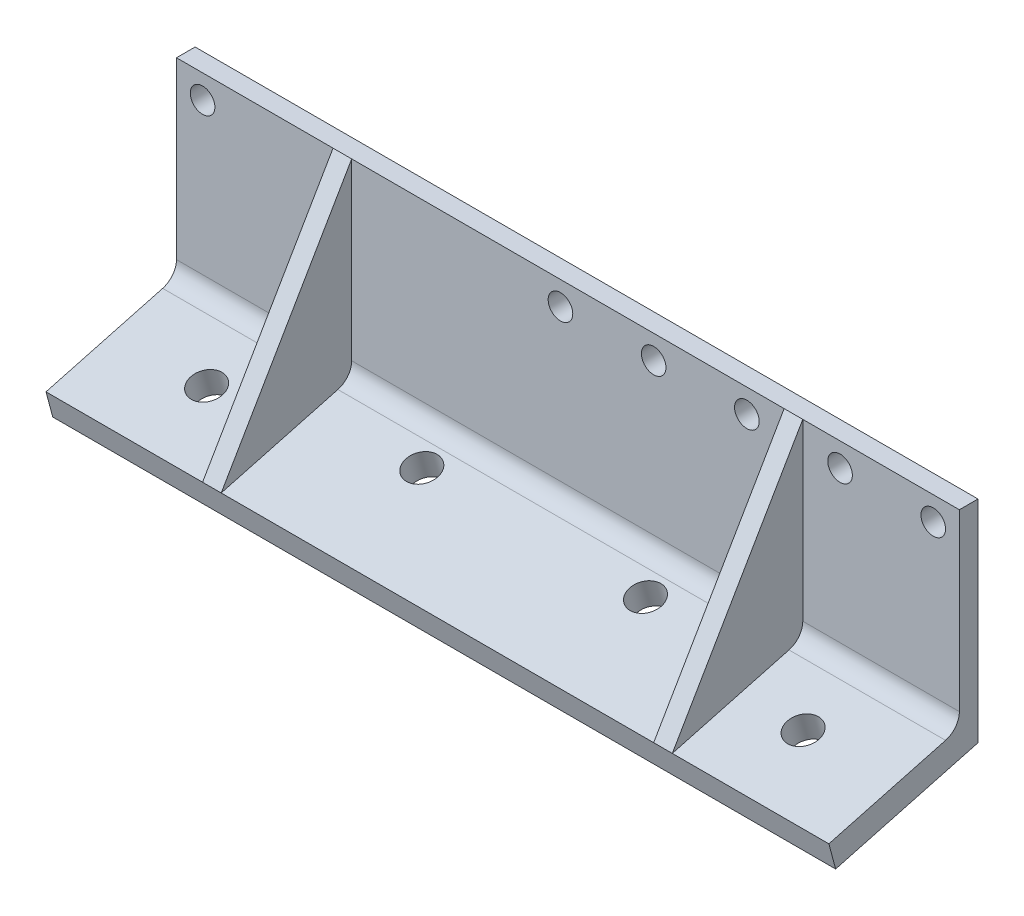
ISO-10303-21;
HEADER;
FILE_DESCRIPTION(('STEP AP214'),'2;1');
FILE_NAME('part.step','',(''),(''),'','','');
FILE_SCHEMA(('AUTOMOTIVE_DESIGN { 1 0 10303 214 1 1 1 1 }'));
ENDSEC;
DATA;
#1=APPLICATION_CONTEXT('core data for automotive mechanical design processes');
#2=APPLICATION_PROTOCOL_DEFINITION('international standard','automotive_design',2000,#1);
#3=PRODUCT_CONTEXT('',#1,'mechanical');
#4=PRODUCT('Part','Part','',(#3));
#5=PRODUCT_RELATED_PRODUCT_CATEGORY('part','',(#4));
#6=PRODUCT_DEFINITION_FORMATION('','',#4);
#7=PRODUCT_DEFINITION_CONTEXT('part definition',#1,'design');
#8=PRODUCT_DEFINITION('design','',#6,#7);
#9=PRODUCT_DEFINITION_SHAPE('','',#8);
#10=(LENGTH_UNIT() NAMED_UNIT(*) SI_UNIT(.MILLI.,.METRE.));
#11=(NAMED_UNIT(*) PLANE_ANGLE_UNIT() SI_UNIT($,.RADIAN.));
#12=(NAMED_UNIT(*) SI_UNIT($,.STERADIAN.) SOLID_ANGLE_UNIT());
#13=UNCERTAINTY_MEASURE_WITH_UNIT(LENGTH_MEASURE(1.E-05),#10,'distance_accuracy_value','');
#14=(GEOMETRIC_REPRESENTATION_CONTEXT(3) GLOBAL_UNCERTAINTY_ASSIGNED_CONTEXT((#13)) GLOBAL_UNIT_ASSIGNED_CONTEXT((#10,
#11,#12)) REPRESENTATION_CONTEXT('',''));
#15=CARTESIAN_POINT('',(0.,0.,0.));
#16=DIRECTION('',(0.,0.,1.));
#17=DIRECTION('',(1.,0.,0.));
#18=AXIS2_PLACEMENT_3D('',#15,#16,#17);
#19=CARTESIAN_POINT('',(-52.,-241.069901587953,57.));
#20=DIRECTION('',(0.,0.,1.));
#21=DIRECTION('',(1.,0.,0.));
#22=AXIS2_PLACEMENT_3D('',#19,#20,#21);
#23=PLANE('',#22);
#24=CARTESIAN_POINT('',(101.,23.65,57.));
#25=DIRECTION('',(0.,0.,1.));
#26=DIRECTION('',(1.,0.,0.));
#27=AXIS2_PLACEMENT_3D('',#24,#25,#26);
#28=CIRCLE('',#27,3.30000000000001);
#29=CARTESIAN_POINT('',(104.3,23.65,57.));
#30=VERTEX_POINT('',#29);
#31=EDGE_CURVE('E437',#30,#30,#28,.T.);
#32=ORIENTED_EDGE('',*,*,#31,.F.);
#33=EDGE_LOOP('',(#32));
#34=FACE_BOUND('',#33,.T.);
#35=CARTESIAN_POINT('',(76.,23.65,57.));
#36=DIRECTION('',(0.,0.,1.));
#37=DIRECTION('',(1.,0.,0.));
#38=AXIS2_PLACEMENT_3D('',#35,#36,#37);
#39=CIRCLE('',#38,3.30000000000001);
#40=CARTESIAN_POINT('',(79.3,23.65,57.));
#41=VERTEX_POINT('',#40);
#42=EDGE_CURVE('E446',#41,#41,#39,.T.);
#43=ORIENTED_EDGE('',*,*,#42,.F.);
#44=EDGE_LOOP('',(#43));
#45=FACE_BOUND('',#44,.T.);
#46=CARTESIAN_POINT('',(51.,23.65,57.));
#47=DIRECTION('',(0.,0.,1.));
#48=DIRECTION('',(1.,0.,0.));
#49=AXIS2_PLACEMENT_3D('',#46,#47,#48);
#50=CIRCLE('',#49,3.3);
#51=CARTESIAN_POINT('',(54.3,23.65,57.));
#52=VERTEX_POINT('',#51);
#53=EDGE_CURVE('E452',#52,#52,#50,.T.);
#54=ORIENTED_EDGE('',*,*,#53,.F.);
#55=EDGE_LOOP('',(#54));
#56=FACE_BOUND('',#55,.T.);
#57=DIRECTION('',(1.,0.,0.));
#58=VECTOR('',#57,1.);
#59=CARTESIAN_POINT('',(-52.,30.,57.));
#60=LINE('',#59,#58);
#61=CARTESIAN_POINT('',(-4.99999999999999,30.,57.));
#62=VERTEX_POINT('',#61);
#63=CARTESIAN_POINT('',(111.,30.,57.));
#64=VERTEX_POINT('',#63);
#65=EDGE_CURVE('E194',#62,#64,#60,.T.);
#66=ORIENTED_EDGE('',*,*,#65,.F.);
#67=DIRECTION('',(0.,-1.,0.));
#68=VECTOR('',#67,1.);
#69=CARTESIAN_POINT('',(-4.99999999999999,30.,57.));
#70=LINE('',#69,#68);
#71=CARTESIAN_POINT('',(-4.99999999999999,-16.891642309636,57.));
#72=VERTEX_POINT('',#71);
#73=EDGE_CURVE('E280',#62,#72,#70,.T.);
#74=ORIENTED_EDGE('',*,*,#73,.T.);
#75=DIRECTION('',(-1.,0.,0.));
#76=VECTOR('',#75,1.);
#77=CARTESIAN_POINT('',(153.,-16.891642309636,57.));
#78=LINE('',#77,#76);
#79=CARTESIAN_POINT('',(111.,-16.891642309636,57.));
#80=VERTEX_POINT('',#79);
#81=EDGE_CURVE('E51',#72,#80,#78,.F.);
#82=ORIENTED_EDGE('',*,*,#81,.T.);
#83=DIRECTION('',(0.,1.,0.));
#84=VECTOR('',#83,1.);
#85=CARTESIAN_POINT('',(111.,-16.891642309636,57.));
#86=LINE('',#85,#84);
#87=EDGE_CURVE('E298',#80,#64,#86,.T.);
#88=ORIENTED_EDGE('',*,*,#87,.T.);
#89=EDGE_LOOP('',(#66,#74,#82,#88));
#90=FACE_BOUND('',#89,.T.);
#91=ADVANCED_FACE('F42',(#34,#45,#56,#90),#23,.T.);
#92=CARTESIAN_POINT('',(196.54205491934,-30.10649898462,92.));
#93=DIRECTION('',(0.,0.965925826289069,0.258819045102519));
#94=DIRECTION('',(0.,-0.258819045102519,0.965925826289069));
#95=AXIS2_PLACEMENT_3D('',#92,#93,#94);
#96=PLANE('',#95);
#97=CARTESIAN_POINT('',(23.,-23.1905949207632,66.1894946534139));
#98=DIRECTION('',(0.,0.965925826289069,0.258819045102519));
#99=DIRECTION('',(0.,-0.258819045102519,0.965925826289069));
#100=AXIS2_PLACEMENT_3D('',#97,#98,#99);
#101=CIRCLE('',#100,4.25);
#102=CARTESIAN_POINT('',(23.,-24.2905758624489,70.2946794151424));
#103=VERTEX_POINT('',#102);
#104=EDGE_CURVE('E328',#103,#103,#101,.T.);
#105=ORIENTED_EDGE('',*,*,#104,.F.);
#106=EDGE_LOOP('',(#105));
#107=FACE_BOUND('',#106,.T.);
#108=CARTESIAN_POINT('',(83.,-23.1905949207632,66.1894946534139));
#109=DIRECTION('',(0.,0.965925826289069,0.258819045102519));
#110=DIRECTION('',(0.,-0.258819045102519,0.965925826289069));
#111=AXIS2_PLACEMENT_3D('',#108,#109,#110);
#112=CIRCLE('',#111,4.25);
#113=CARTESIAN_POINT('',(83.,-24.2905758624489,70.2946794151424));
#114=VERTEX_POINT('',#113);
#115=EDGE_CURVE('E332',#114,#114,#112,.T.);
#116=ORIENTED_EDGE('',*,*,#115,.F.);
#117=EDGE_LOOP('',(#116));
#118=FACE_BOUND('',#117,.T.);
#119=DIRECTION('',(-1.,0.,0.));
#120=VECTOR('',#119,1.);
#121=CARTESIAN_POINT('',(-47.,-21.7212714410813,60.7059047744874));
#122=LINE('',#121,#120);
#123=CARTESIAN_POINT('',(111.,-21.7212714410813,60.7059047744874));
#124=VERTEX_POINT('',#123);
#125=CARTESIAN_POINT('',(-4.99999999999999,-21.7212714410813,60.7059047744874));
#126=VERTEX_POINT('',#125);
#127=EDGE_CURVE('E229',#124,#126,#122,.T.);
#128=ORIENTED_EDGE('',*,*,#127,.T.);
#129=DIRECTION('',(0.,-0.258819045102519,0.965925826289069));
#130=VECTOR('',#129,1.);
#131=CARTESIAN_POINT('',(-4.99999999999999,-21.7212714410813,60.7059047744874));
#132=LINE('',#131,#130);
#133=CARTESIAN_POINT('',(-4.99999999999999,-30.10649898462,92.));
#134=VERTEX_POINT('',#133);
#135=EDGE_CURVE('E272',#126,#134,#132,.T.);
#136=ORIENTED_EDGE('',*,*,#135,.T.);
#137=DIRECTION('',(-1.,0.,0.));
#138=VECTOR('',#137,1.);
#139=CARTESIAN_POINT('',(196.54205491934,-30.10649898462,92.));
#140=LINE('',#139,#138);
#141=CARTESIAN_POINT('',(111.,-30.10649898462,92.));
#142=VERTEX_POINT('',#141);
#143=EDGE_CURVE('E202',#142,#134,#140,.T.);
#144=ORIENTED_EDGE('',*,*,#143,.F.);
#145=DIRECTION('',(0.,0.258819045102519,-0.965925826289069));
#146=VECTOR('',#145,1.);
#147=CARTESIAN_POINT('',(111.,-30.10649898462,92.));
#148=LINE('',#147,#146);
#149=EDGE_CURVE('E307',#142,#124,#148,.T.);
#150=ORIENTED_EDGE('',*,*,#149,.T.);
#151=EDGE_LOOP('',(#128,#136,#144,#150));
#152=FACE_BOUND('',#151,.T.);
#153=ADVANCED_FACE('F379',(#107,#118,#152),#96,.T.);
#154=CARTESIAN_POINT('',(196.54205491934,-16.891642309636,62.));
#155=DIRECTION('',(1.,0.,0.));
#156=DIRECTION('',(0.,0.,-1.));
#157=AXIS2_PLACEMENT_3D('',#154,#155,#156);
#158=CYLINDRICAL_SURFACE('',#157,5.);
#159=CARTESIAN_POINT('',(-4.99999999999999,-16.891642309636,62.));
#160=DIRECTION('',(-1.,0.,0.));
#161=DIRECTION('',(0.,0.,1.));
#162=AXIS2_PLACEMENT_3D('',#159,#160,#161);
#163=CIRCLE('',#162,5.);
#164=EDGE_CURVE('E283',#72,#126,#163,.T.);
#165=ORIENTED_EDGE('',*,*,#164,.T.);
#166=ORIENTED_EDGE('',*,*,#127,.F.);
#167=CARTESIAN_POINT('',(111.,-16.891642309636,62.));
#168=DIRECTION('',(1.,0.,0.));
#169=DIRECTION('',(0.,0.,-1.));
#170=AXIS2_PLACEMENT_3D('',#167,#168,#169);
#171=CIRCLE('',#170,5.);
#172=EDGE_CURVE('E310',#124,#80,#171,.T.);
#173=ORIENTED_EDGE('',*,*,#172,.T.);
#174=ORIENTED_EDGE('',*,*,#81,.F.);
#175=EDGE_LOOP('',(#165,#166,#173,#174));
#176=FACE_BOUND('',#175,.T.);
#177=ADVANCED_FACE('F383',(#176),#158,.F.);
#178=CARTESIAN_POINT('',(-45.,23.65,57.));
#179=DIRECTION('',(0.,0.,1.));
#180=DIRECTION('',(1.,0.,0.));
#181=AXIS2_PLACEMENT_3D('',#178,#179,#180);
#182=CIRCLE('',#181,3.3);
#183=CARTESIAN_POINT('',(-41.7,23.65,57.));
#184=VERTEX_POINT('',#183);
#185=EDGE_CURVE('E540',#184,#184,#182,.T.);
#186=ORIENTED_EDGE('',*,*,#185,.F.);
#187=EDGE_LOOP('',(#186));
#188=FACE_BOUND('',#187,.T.);
#189=DIRECTION('',(0.,-1.,0.));
#190=VECTOR('',#189,1.);
#191=CARTESIAN_POINT('',(-9.99999999999998,30.,57.));
#192=LINE('',#191,#190);
#193=CARTESIAN_POINT('',(-9.99999999999998,30.,57.));
#194=VERTEX_POINT('',#193);
#195=CARTESIAN_POINT('',(-9.99999999999998,-16.891642309636,57.));
#196=VERTEX_POINT('',#195);
#197=EDGE_CURVE('E271',#194,#196,#192,.T.);
#198=ORIENTED_EDGE('',*,*,#197,.F.);
#199=CARTESIAN_POINT('',(-52.,30.,57.));
#200=VERTEX_POINT('',#199);
#201=EDGE_CURVE('E206',#200,#194,#60,.T.);
#202=ORIENTED_EDGE('',*,*,#201,.F.);
#203=DIRECTION('',(0.,1.,0.));
#204=VECTOR('',#203,1.);
#205=CARTESIAN_POINT('',(-52.,-16.891642309636,57.));
#206=LINE('',#205,#204);
#207=CARTESIAN_POINT('',(-52.,-16.891642309636,57.));
#208=VERTEX_POINT('',#207);
#209=EDGE_CURVE('E256',#208,#200,#206,.T.);
#210=ORIENTED_EDGE('',*,*,#209,.F.);
#211=EDGE_CURVE('E11',#208,#196,#78,.F.);
#212=ORIENTED_EDGE('',*,*,#211,.T.);
#213=EDGE_LOOP('',(#198,#202,#210,#212));
#214=FACE_BOUND('',#213,.T.);
#215=ADVANCED_FACE('F390',(#188,#214),#23,.T.);
#216=DIRECTION('',(0.,-0.258819045102519,0.965925826289069));
#217=VECTOR('',#216,1.);
#218=CARTESIAN_POINT('',(-9.99999999999998,-21.7212714410813,60.7059047744874));
#219=LINE('',#218,#217);
#220=CARTESIAN_POINT('',(-9.99999999999998,-21.7212714410813,60.7059047744874));
#221=VERTEX_POINT('',#220);
#222=CARTESIAN_POINT('',(-9.99999999999993,-30.10649898462,92.));
#223=VERTEX_POINT('',#222);
#224=EDGE_CURVE('E247',#221,#223,#219,.T.);
#225=ORIENTED_EDGE('',*,*,#224,.F.);
#226=CARTESIAN_POINT('',(-52.,-21.7212714410813,60.7059047744874));
#227=VERTEX_POINT('',#226);
#228=EDGE_CURVE('E170',#221,#227,#122,.T.);
#229=ORIENTED_EDGE('',*,*,#228,.T.);
#230=DIRECTION('',(0.,0.258819045102519,-0.965925826289069));
#231=VECTOR('',#230,1.);
#232=CARTESIAN_POINT('',(-52.,-30.10649898462,92.));
#233=LINE('',#232,#231);
#234=CARTESIAN_POINT('',(-52.,-30.10649898462,92.));
#235=VERTEX_POINT('',#234);
#236=EDGE_CURVE('E245',#235,#227,#233,.T.);
#237=ORIENTED_EDGE('',*,*,#236,.F.);
#238=DIRECTION('',(-1.,0.,0.));
#239=VECTOR('',#238,1.);
#240=CARTESIAN_POINT('',(-47.,-30.10649898462,92.));
#241=LINE('',#240,#239);
#242=EDGE_CURVE('E59',#223,#235,#241,.T.);
#243=ORIENTED_EDGE('',*,*,#242,.F.);
#244=EDGE_LOOP('',(#225,#229,#237,#243));
#245=FACE_BOUND('',#244,.T.);
#246=CARTESIAN_POINT('',(-27.,-25.2611472815833,73.9169012637264));
#247=DIRECTION('',(0.,0.965925826289069,0.258819045102519));
#248=DIRECTION('',(0.,-0.258819045102519,0.965925826289069));
#249=AXIS2_PLACEMENT_3D('',#246,#247,#248);
#250=CIRCLE('',#249,4.25);
#251=CARTESIAN_POINT('',(-27.,-26.361128223269,78.022086025455));
#252=VERTEX_POINT('',#251);
#253=EDGE_CURVE('E324',#252,#252,#250,.T.);
#254=ORIENTED_EDGE('',*,*,#253,.F.);
#255=EDGE_LOOP('',(#254));
#256=FACE_BOUND('',#255,.T.);
#257=ADVANCED_FACE('F242',(#245,#256),#96,.T.);
#258=ORIENTED_EDGE('',*,*,#228,.F.);
#259=CARTESIAN_POINT('',(-9.99999999999998,-16.891642309636,62.));
#260=DIRECTION('',(-1.,0.,0.));
#261=DIRECTION('',(0.,0.,1.));
#262=AXIS2_PLACEMENT_3D('',#259,#260,#261);
#263=CIRCLE('',#262,5.);
#264=EDGE_CURVE('E274',#196,#221,#263,.T.);
#265=ORIENTED_EDGE('',*,*,#264,.F.);
#266=ORIENTED_EDGE('',*,*,#211,.F.);
#267=CARTESIAN_POINT('',(-52.,-16.891642309636,62.));
#268=DIRECTION('',(1.,0.,0.));
#269=DIRECTION('',(0.,0.,-1.));
#270=AXIS2_PLACEMENT_3D('',#267,#268,#269);
#271=CIRCLE('',#270,5.);
#272=EDGE_CURVE('E251',#227,#208,#271,.T.);
#273=ORIENTED_EDGE('',*,*,#272,.F.);
#274=EDGE_LOOP('',(#258,#265,#266,#273));
#275=FACE_BOUND('',#274,.T.);
#276=ADVANCED_FACE('F252',(#275),#158,.F.);
#277=CARTESIAN_POINT('',(160.,30.,-31.93));
#278=DIRECTION('',(0.,1.,0.));
#279=DIRECTION('',(0.,0.,1.));
#280=AXIS2_PLACEMENT_3D('',#277,#278,#279);
#281=PLANE('',#280);
#282=DIRECTION('',(1.,0.,0.));
#283=VECTOR('',#282,1.);
#284=CARTESIAN_POINT('',(160.,30.,52.));
#285=LINE('',#284,#283);
#286=CARTESIAN_POINT('',(-52.,30.,52.));
#287=VERTEX_POINT('',#286);
#288=CARTESIAN_POINT('',(158.,30.,52.));
#289=VERTEX_POINT('',#288);
#290=EDGE_CURVE('E321',#287,#289,#285,.T.);
#291=ORIENTED_EDGE('',*,*,#290,.F.);
#292=DIRECTION('',(0.,0.,1.));
#293=VECTOR('',#292,1.);
#294=CARTESIAN_POINT('',(-52.,30.,0.));
#295=LINE('',#294,#293);
#296=EDGE_CURVE('E171',#287,#200,#295,.T.);
#297=ORIENTED_EDGE('',*,*,#296,.T.);
#298=ORIENTED_EDGE('',*,*,#201,.T.);
#299=DIRECTION('',(1.,0.,0.));
#300=VECTOR('',#299,1.);
#301=CARTESIAN_POINT('',(-9.99999999999998,30.,57.));
#302=LINE('',#301,#300);
#303=EDGE_CURVE('E289',#194,#62,#302,.T.);
#304=ORIENTED_EDGE('',*,*,#303,.T.);
#305=ORIENTED_EDGE('',*,*,#65,.T.);
#306=DIRECTION('',(-1.,0.,0.));
#307=VECTOR('',#306,1.);
#308=CARTESIAN_POINT('',(116.,30.,57.));
#309=LINE('',#308,#307);
#310=CARTESIAN_POINT('',(116.,30.,57.));
#311=VERTEX_POINT('',#310);
#312=EDGE_CURVE('E175',#311,#64,#309,.T.);
#313=ORIENTED_EDGE('',*,*,#312,.F.);
#314=DIRECTION('',(1.,0.,0.));
#315=VECTOR('',#314,1.);
#316=CARTESIAN_POINT('',(153.,30.,57.));
#317=LINE('',#316,#315);
#318=CARTESIAN_POINT('',(158.,30.,57.));
#319=VERTEX_POINT('',#318);
#320=EDGE_CURVE('E67',#311,#319,#317,.T.);
#321=ORIENTED_EDGE('',*,*,#320,.T.);
#322=DIRECTION('',(0.,0.,1.));
#323=VECTOR('',#322,1.);
#324=CARTESIAN_POINT('',(158.,30.,0.));
#325=LINE('',#324,#323);
#326=EDGE_CURVE('E161',#289,#319,#325,.T.);
#327=ORIENTED_EDGE('',*,*,#326,.F.);
#328=EDGE_LOOP('',(#291,#297,#298,#304,#305,#313,#321,#327));
#329=FACE_BOUND('',#328,.T.);
#330=ADVANCED_FACE('F173',(#329),#281,.T.);
#331=CARTESIAN_POINT('',(158.,0.,0.));
#332=DIRECTION('',(-1.,0.,0.));
#333=DIRECTION('',(0.,0.,1.));
#334=AXIS2_PLACEMENT_3D('',#331,#332,#333);
#335=PLANE('',#334);
#336=CARTESIAN_POINT('',(158.,-16.891642309636,62.));
#337=DIRECTION('',(-1.,0.,0.));
#338=DIRECTION('',(0.,0.,1.));
#339=AXIS2_PLACEMENT_3D('',#336,#337,#338);
#340=CIRCLE('',#339,5.);
#341=CARTESIAN_POINT('',(158.,-16.891642309636,57.));
#342=VERTEX_POINT('',#341);
#343=CARTESIAN_POINT('',(158.,-21.7212714410813,60.7059047744874));
#344=VERTEX_POINT('',#343);
#345=EDGE_CURVE('E157',#342,#344,#340,.T.);
#346=ORIENTED_EDGE('',*,*,#345,.T.);
#347=DIRECTION('',(0.,-0.258819045102519,0.965925826289069));
#348=VECTOR('',#347,1.);
#349=CARTESIAN_POINT('',(158.,-21.7212714410813,60.7059047744874));
#350=LINE('',#349,#348);
#351=CARTESIAN_POINT('',(158.,-30.10649898462,92.));
#352=VERTEX_POINT('',#351);
#353=EDGE_CURVE('E260',#344,#352,#350,.T.);
#354=ORIENTED_EDGE('',*,*,#353,.T.);
#355=DIRECTION('',(0.,-0.965925826289069,-0.258819045102518));
#356=VECTOR('',#355,1.);
#357=CARTESIAN_POINT('',(158.,-36.8679797686435,90.1882666842824));
#358=LINE('',#357,#356);
#359=CARTESIAN_POINT('',(158.,-36.8679797686435,90.1882666842824));
#360=VERTEX_POINT('',#359);
#361=EDGE_CURVE('E190',#352,#360,#358,.T.);
#362=ORIENTED_EDGE('',*,*,#361,.T.);
#363=DIRECTION('',(0.,0.258819045102521,-0.965925826289068));
#364=VECTOR('',#363,1.);
#365=CARTESIAN_POINT('',(158.,-40.9998481086648,105.608609259427));
#366=LINE('',#365,#364);
#367=CARTESIAN_POINT('',(158.,-26.6354645502457,52.));
#368=VERTEX_POINT('',#367);
#369=EDGE_CURVE('E209',#360,#368,#366,.T.);
#370=ORIENTED_EDGE('',*,*,#369,.T.);
#371=DIRECTION('',(0.,1.,0.));
#372=VECTOR('',#371,1.);
#373=CARTESIAN_POINT('',(158.,-241.069901587953,52.));
#374=LINE('',#373,#372);
#375=EDGE_CURVE('E165',#368,#289,#374,.T.);
#376=ORIENTED_EDGE('',*,*,#375,.T.);
#377=ORIENTED_EDGE('',*,*,#326,.T.);
#378=DIRECTION('',(0.,-1.,0.));
#379=VECTOR('',#378,1.);
#380=CARTESIAN_POINT('',(158.,30.,57.));
#381=LINE('',#380,#379);
#382=EDGE_CURVE('E150',#319,#342,#381,.T.);
#383=ORIENTED_EDGE('',*,*,#382,.T.);
#384=EDGE_LOOP('',(#346,#354,#362,#370,#376,#377,#383));
#385=FACE_BOUND('',#384,.T.);
#386=ADVANCED_FACE('F162',(#385),#335,.F.);
#387=CARTESIAN_POINT('',(-52.,0.,0.));
#388=DIRECTION('',(-1.,0.,0.));
#389=DIRECTION('',(0.,0.,1.));
#390=AXIS2_PLACEMENT_3D('',#387,#388,#389);
#391=PLANE('',#390);
#392=ORIENTED_EDGE('',*,*,#209,.T.);
#393=ORIENTED_EDGE('',*,*,#296,.F.);
#394=DIRECTION('',(0.,1.,0.));
#395=VECTOR('',#394,1.);
#396=CARTESIAN_POINT('',(-52.,-241.069901587953,52.));
#397=LINE('',#396,#395);
#398=CARTESIAN_POINT('',(-52.,-26.6354645502457,52.));
#399=VERTEX_POINT('',#398);
#400=EDGE_CURVE('E213',#399,#287,#397,.T.);
#401=ORIENTED_EDGE('',*,*,#400,.F.);
#402=DIRECTION('',(0.,-0.258819045102521,0.965925826289068));
#403=VECTOR('',#402,1.);
#404=CARTESIAN_POINT('',(-51.9999999999999,-40.9998481086648,105.608609259427));
#405=LINE('',#404,#403);
#406=CARTESIAN_POINT('',(-52.,-36.8679797686435,90.1882666842824));
#407=VERTEX_POINT('',#406);
#408=EDGE_CURVE('E210',#399,#407,#405,.T.);
#409=ORIENTED_EDGE('',*,*,#408,.T.);
#410=DIRECTION('',(0.,0.965925826289069,0.258819045102519));
#411=VECTOR('',#410,1.);
#412=CARTESIAN_POINT('',(-52.,-36.8679797686435,90.1882666842824));
#413=LINE('',#412,#411);
#414=EDGE_CURVE('E183',#407,#235,#413,.T.);
#415=ORIENTED_EDGE('',*,*,#414,.T.);
#416=ORIENTED_EDGE('',*,*,#236,.T.);
#417=ORIENTED_EDGE('',*,*,#272,.T.);
#418=EDGE_LOOP('',(#392,#393,#401,#409,#415,#416,#417));
#419=FACE_BOUND('',#418,.T.);
#420=ADVANCED_FACE('F258',(#419),#391,.T.);
#421=CARTESIAN_POINT('',(-52.,-241.069901587953,52.));
#422=DIRECTION('',(0.,0.,-1.));
#423=DIRECTION('',(-1.,0.,0.));
#424=AXIS2_PLACEMENT_3D('',#421,#422,#423);
#425=PLANE('',#424);
#426=CARTESIAN_POINT('',(-45.,23.65,52.));
#427=DIRECTION('',(0.,0.,1.));
#428=DIRECTION('',(1.,0.,0.));
#429=AXIS2_PLACEMENT_3D('',#426,#427,#428);
#430=CIRCLE('',#429,3.3);
#431=CARTESIAN_POINT('',(-41.7,23.65,52.));
#432=VERTEX_POINT('',#431);
#433=EDGE_CURVE('E158',#432,#432,#430,.T.);
#434=ORIENTED_EDGE('',*,*,#433,.T.);
#435=EDGE_LOOP('',(#434));
#436=FACE_BOUND('',#435,.T.);
#437=CARTESIAN_POINT('',(151.,23.65,52.));
#438=DIRECTION('',(0.,0.,1.));
#439=DIRECTION('',(1.,0.,0.));
#440=AXIS2_PLACEMENT_3D('',#437,#438,#439);
#441=CIRCLE('',#440,3.3);
#442=CARTESIAN_POINT('',(154.3,23.65,52.));
#443=VERTEX_POINT('',#442);
#444=EDGE_CURVE('E500',#443,#443,#441,.T.);
#445=ORIENTED_EDGE('',*,*,#444,.T.);
#446=EDGE_LOOP('',(#445));
#447=FACE_BOUND('',#446,.T.);
#448=CARTESIAN_POINT('',(126.,23.65,52.));
#449=DIRECTION('',(0.,0.,1.));
#450=DIRECTION('',(1.,0.,0.));
#451=AXIS2_PLACEMENT_3D('',#448,#449,#450);
#452=CIRCLE('',#451,3.3);
#453=CARTESIAN_POINT('',(129.3,23.65,52.));
#454=VERTEX_POINT('',#453);
#455=EDGE_CURVE('E431',#454,#454,#452,.T.);
#456=ORIENTED_EDGE('',*,*,#455,.T.);
#457=EDGE_LOOP('',(#456));
#458=FACE_BOUND('',#457,.T.);
#459=CARTESIAN_POINT('',(101.,23.65,52.));
#460=DIRECTION('',(0.,0.,1.));
#461=DIRECTION('',(1.,0.,0.));
#462=AXIS2_PLACEMENT_3D('',#459,#460,#461);
#463=CIRCLE('',#462,3.30000000000001);
#464=CARTESIAN_POINT('',(104.3,23.65,52.));
#465=VERTEX_POINT('',#464);
#466=EDGE_CURVE('E432',#465,#465,#463,.T.);
#467=ORIENTED_EDGE('',*,*,#466,.T.);
#468=EDGE_LOOP('',(#467));
#469=FACE_BOUND('',#468,.T.);
#470=CARTESIAN_POINT('',(76.,23.65,52.));
#471=DIRECTION('',(0.,0.,1.));
#472=DIRECTION('',(1.,0.,0.));
#473=AXIS2_PLACEMENT_3D('',#470,#471,#472);
#474=CIRCLE('',#473,3.30000000000001);
#475=CARTESIAN_POINT('',(79.3,23.65,52.));
#476=VERTEX_POINT('',#475);
#477=EDGE_CURVE('E443',#476,#476,#474,.T.);
#478=ORIENTED_EDGE('',*,*,#477,.T.);
#479=EDGE_LOOP('',(#478));
#480=FACE_BOUND('',#479,.T.);
#481=CARTESIAN_POINT('',(51.,23.65,52.));
#482=DIRECTION('',(0.,0.,1.));
#483=DIRECTION('',(1.,0.,0.));
#484=AXIS2_PLACEMENT_3D('',#481,#482,#483);
#485=CIRCLE('',#484,3.3);
#486=CARTESIAN_POINT('',(54.3,23.65,52.));
#487=VERTEX_POINT('',#486);
#488=EDGE_CURVE('E449',#487,#487,#485,.T.);
#489=ORIENTED_EDGE('',*,*,#488,.T.);
#490=EDGE_LOOP('',(#489));
#491=FACE_BOUND('',#490,.T.);
#492=ORIENTED_EDGE('',*,*,#400,.T.);
#493=ORIENTED_EDGE('',*,*,#290,.T.);
#494=ORIENTED_EDGE('',*,*,#375,.F.);
#495=DIRECTION('',(-1.,0.,0.));
#496=VECTOR('',#495,1.);
#497=CARTESIAN_POINT('',(-52.,-26.6354645502457,52.));
#498=LINE('',#497,#496);
#499=EDGE_CURVE('E214',#368,#399,#498,.T.);
#500=ORIENTED_EDGE('',*,*,#499,.T.);
#501=EDGE_LOOP('',(#492,#493,#494,#500));
#502=FACE_BOUND('',#501,.T.);
#503=ADVANCED_FACE('F355',(#436,#447,#458,#469,#480,#491,#502),#425,.T.);
#504=CARTESIAN_POINT('',(0.,-11.8512267461792,-3.17552663595684));
#505=DIRECTION('',(0.,-0.965925826289068,-0.258819045102521));
#506=DIRECTION('',(0.,0.258819045102521,-0.965925826289068));
#507=AXIS2_PLACEMENT_3D('',#504,#505,#506);
#508=PLANE('',#507);
#509=CARTESIAN_POINT('',(-27.,-32.0226280656068,72.1051679480088));
#510=DIRECTION('',(0.,-0.965925826289068,-0.258819045102521));
#511=DIRECTION('',(0.,0.258819045102521,-0.965925826289068));
#512=AXIS2_PLACEMENT_3D('',#509,#510,#511);
#513=CIRCLE('',#512,4.25);
#514=CARTESIAN_POINT('',(-27.,-30.9226471239211,67.9999831862803));
#515=VERTEX_POINT('',#514);
#516=EDGE_CURVE('E178',#515,#515,#513,.T.);
#517=ORIENTED_EDGE('',*,*,#516,.F.);
#518=EDGE_LOOP('',(#517));
#519=FACE_BOUND('',#518,.T.);
#520=CARTESIAN_POINT('',(23.,-29.9520757047866,64.3777613376962));
#521=DIRECTION('',(0.,-0.965925826289068,-0.258819045102521));
#522=DIRECTION('',(0.,0.258819045102521,-0.965925826289068));
#523=AXIS2_PLACEMENT_3D('',#520,#521,#522);
#524=CIRCLE('',#523,4.25);
#525=CARTESIAN_POINT('',(23.,-28.8520947631009,60.2725765759677));
#526=VERTEX_POINT('',#525);
#527=EDGE_CURVE('E186',#526,#526,#524,.T.);
#528=ORIENTED_EDGE('',*,*,#527,.F.);
#529=EDGE_LOOP('',(#528));
#530=FACE_BOUND('',#529,.T.);
#531=CARTESIAN_POINT('',(83.,-29.9520757047866,64.3777613376962));
#532=DIRECTION('',(0.,-0.965925826289068,-0.258819045102521));
#533=DIRECTION('',(0.,0.258819045102521,-0.965925826289068));
#534=AXIS2_PLACEMENT_3D('',#531,#532,#533);
#535=CIRCLE('',#534,4.25);
#536=CARTESIAN_POINT('',(83.,-28.8520947631009,60.2725765759677));
#537=VERTEX_POINT('',#536);
#538=EDGE_CURVE('E342',#537,#537,#535,.T.);
#539=ORIENTED_EDGE('',*,*,#538,.F.);
#540=EDGE_LOOP('',(#539));
#541=FACE_BOUND('',#540,.T.);
#542=CARTESIAN_POINT('',(133.,-32.0226280656068,72.1051679480088));
#543=DIRECTION('',(0.,-0.965925826289068,-0.258819045102521));
#544=DIRECTION('',(0.,0.258819045102521,-0.965925826289068));
#545=AXIS2_PLACEMENT_3D('',#542,#543,#544);
#546=CIRCLE('',#545,4.25);
#547=CARTESIAN_POINT('',(133.,-30.9226471239211,67.9999831862803));
#548=VERTEX_POINT('',#547);
#549=EDGE_CURVE('E327',#548,#548,#546,.T.);
#550=ORIENTED_EDGE('',*,*,#549,.F.);
#551=EDGE_LOOP('',(#550));
#552=FACE_BOUND('',#551,.T.);
#553=ORIENTED_EDGE('',*,*,#408,.F.);
#554=ORIENTED_EDGE('',*,*,#499,.F.);
#555=ORIENTED_EDGE('',*,*,#369,.F.);
#556=DIRECTION('',(-1.,0.,0.));
#557=VECTOR('',#556,1.);
#558=CARTESIAN_POINT('',(196.54205491934,-36.8679797686435,90.1882666842824));
#559=LINE('',#558,#557);
#560=EDGE_CURVE('E199',#360,#407,#559,.T.);
#561=ORIENTED_EDGE('',*,*,#560,.T.);
#562=EDGE_LOOP('',(#553,#554,#555,#561));
#563=FACE_BOUND('',#562,.T.);
#564=ADVANCED_FACE('F352',(#519,#530,#541,#552,#563),#508,.T.);
#565=CARTESIAN_POINT('',(151.,23.65,57.));
#566=DIRECTION('',(0.,0.,1.));
#567=DIRECTION('',(1.,0.,0.));
#568=AXIS2_PLACEMENT_3D('',#565,#566,#567);
#569=CIRCLE('',#568,3.3);
#570=CARTESIAN_POINT('',(154.3,23.65,57.));
#571=VERTEX_POINT('',#570);
#572=EDGE_CURVE('E426',#571,#571,#569,.T.);
#573=ORIENTED_EDGE('',*,*,#572,.F.);
#574=EDGE_LOOP('',(#573));
#575=FACE_BOUND('',#574,.T.);
#576=CARTESIAN_POINT('',(126.,23.65,57.));
#577=DIRECTION('',(0.,0.,1.));
#578=DIRECTION('',(1.,0.,0.));
#579=AXIS2_PLACEMENT_3D('',#576,#577,#578);
#580=CIRCLE('',#579,3.3);
#581=CARTESIAN_POINT('',(129.3,23.65,57.));
#582=VERTEX_POINT('',#581);
#583=EDGE_CURVE('E429',#582,#582,#580,.T.);
#584=ORIENTED_EDGE('',*,*,#583,.F.);
#585=EDGE_LOOP('',(#584));
#586=FACE_BOUND('',#585,.T.);
#587=DIRECTION('',(0.,1.,0.));
#588=VECTOR('',#587,1.);
#589=CARTESIAN_POINT('',(116.,-16.891642309636,57.));
#590=LINE('',#589,#588);
#591=CARTESIAN_POINT('',(116.,-16.891642309636,57.));
#592=VERTEX_POINT('',#591);
#593=EDGE_CURVE('E303',#592,#311,#590,.T.);
#594=ORIENTED_EDGE('',*,*,#593,.F.);
#595=EDGE_CURVE('E52',#592,#342,#78,.F.);
#596=ORIENTED_EDGE('',*,*,#595,.T.);
#597=ORIENTED_EDGE('',*,*,#382,.F.);
#598=ORIENTED_EDGE('',*,*,#320,.F.);
#599=EDGE_LOOP('',(#594,#596,#597,#598));
#600=FACE_BOUND('',#599,.T.);
#601=ADVANCED_FACE('F152',(#575,#586,#600),#23,.T.);
#602=DIRECTION('',(0.,0.258819045102519,-0.965925826289069));
#603=VECTOR('',#602,1.);
#604=CARTESIAN_POINT('',(116.,-30.10649898462,92.));
#605=LINE('',#604,#603);
#606=CARTESIAN_POINT('',(116.,-30.10649898462,92.));
#607=VERTEX_POINT('',#606);
#608=CARTESIAN_POINT('',(116.,-21.7212714410813,60.7059047744874));
#609=VERTEX_POINT('',#608);
#610=EDGE_CURVE('E297',#607,#609,#605,.T.);
#611=ORIENTED_EDGE('',*,*,#610,.F.);
#612=EDGE_CURVE('E195',#352,#607,#140,.T.);
#613=ORIENTED_EDGE('',*,*,#612,.F.);
#614=ORIENTED_EDGE('',*,*,#353,.F.);
#615=EDGE_CURVE('E226',#344,#609,#122,.T.);
#616=ORIENTED_EDGE('',*,*,#615,.T.);
#617=EDGE_LOOP('',(#611,#613,#614,#616));
#618=FACE_BOUND('',#617,.T.);
#619=CARTESIAN_POINT('',(133.,-25.2611472815833,73.9169012637264));
#620=DIRECTION('',(0.,0.965925826289069,0.258819045102519));
#621=DIRECTION('',(0.,-0.258819045102519,0.965925826289069));
#622=AXIS2_PLACEMENT_3D('',#619,#620,#621);
#623=CIRCLE('',#622,4.25);
#624=CARTESIAN_POINT('',(133.,-26.361128223269,78.022086025455));
#625=VERTEX_POINT('',#624);
#626=EDGE_CURVE('E323',#625,#625,#623,.T.);
#627=ORIENTED_EDGE('',*,*,#626,.F.);
#628=EDGE_LOOP('',(#627));
#629=FACE_BOUND('',#628,.T.);
#630=ADVANCED_FACE('F412',(#618,#629),#96,.T.);
#631=CARTESIAN_POINT('',(196.54205491934,-36.8679797686435,90.1882666842824));
#632=DIRECTION('',(0.,-0.258819045102518,0.965925826289069));
#633=DIRECTION('',(0.,-0.965925826289069,-0.258819045102518));
#634=AXIS2_PLACEMENT_3D('',#631,#632,#633);
#635=PLANE('',#634);
#636=ORIENTED_EDGE('',*,*,#361,.F.);
#637=ORIENTED_EDGE('',*,*,#612,.T.);
#638=DIRECTION('',(-1.,0.,0.));
#639=VECTOR('',#638,1.);
#640=CARTESIAN_POINT('',(116.,-30.10649898462,92.));
#641=LINE('',#640,#639);
#642=EDGE_CURVE('E317',#607,#142,#641,.T.);
#643=ORIENTED_EDGE('',*,*,#642,.T.);
#644=ORIENTED_EDGE('',*,*,#143,.T.);
#645=DIRECTION('',(1.,0.,0.));
#646=VECTOR('',#645,1.);
#647=CARTESIAN_POINT('',(-9.99999999999998,-30.10649898462,92.));
#648=LINE('',#647,#646);
#649=EDGE_CURVE('E277',#223,#134,#648,.T.);
#650=ORIENTED_EDGE('',*,*,#649,.F.);
#651=ORIENTED_EDGE('',*,*,#242,.T.);
#652=ORIENTED_EDGE('',*,*,#414,.F.);
#653=ORIENTED_EDGE('',*,*,#560,.F.);
#654=EDGE_LOOP('',(#636,#637,#643,#644,#650,#651,#652,#653));
#655=FACE_BOUND('',#654,.T.);
#656=ADVANCED_FACE('F368',(#655),#635,.T.);
#657=CARTESIAN_POINT('',(133.,-78.3196947366772,59.6999063215657));
#658=DIRECTION('',(0.,0.965925826289069,0.25881904510252));
#659=DIRECTION('',(0.,-0.25881904510252,0.965925826289069));
#660=AXIS2_PLACEMENT_3D('',#657,#658,#659);
#661=CYLINDRICAL_SURFACE('',#660,4.25);
#662=ORIENTED_EDGE('',*,*,#549,.T.);
#663=EDGE_LOOP('',(#662));
#664=FACE_BOUND('',#663,.T.);
#665=ORIENTED_EDGE('',*,*,#626,.T.);
#666=EDGE_LOOP('',(#665));
#667=FACE_BOUND('',#666,.T.);
#668=ADVANCED_FACE('F482',(#664,#667),#661,.F.);
#669=CARTESIAN_POINT('',(83.,-76.249142375857,51.9724997112532));
#670=DIRECTION('',(0.,0.965925826289069,0.25881904510252));
#671=DIRECTION('',(0.,-0.25881904510252,0.965925826289069));
#672=AXIS2_PLACEMENT_3D('',#669,#670,#671);
#673=CYLINDRICAL_SURFACE('',#672,4.25);
#674=ORIENTED_EDGE('',*,*,#538,.T.);
#675=EDGE_LOOP('',(#674));
#676=FACE_BOUND('',#675,.T.);
#677=ORIENTED_EDGE('',*,*,#115,.T.);
#678=EDGE_LOOP('',(#677));
#679=FACE_BOUND('',#678,.T.);
#680=ADVANCED_FACE('F479',(#676,#679),#673,.F.);
#681=CARTESIAN_POINT('',(23.,-76.249142375857,51.9724997112532));
#682=DIRECTION('',(0.,0.965925826289069,0.25881904510252));
#683=DIRECTION('',(0.,-0.25881904510252,0.965925826289069));
#684=AXIS2_PLACEMENT_3D('',#681,#682,#683);
#685=CYLINDRICAL_SURFACE('',#684,4.25);
#686=ORIENTED_EDGE('',*,*,#527,.T.);
#687=EDGE_LOOP('',(#686));
#688=FACE_BOUND('',#687,.T.);
#689=ORIENTED_EDGE('',*,*,#104,.T.);
#690=EDGE_LOOP('',(#689));
#691=FACE_BOUND('',#690,.T.);
#692=ADVANCED_FACE('F349',(#688,#691),#685,.F.);
#693=CARTESIAN_POINT('',(-27.,-78.3196947366772,59.6999063215657));
#694=DIRECTION('',(0.,0.965925826289069,0.25881904510252));
#695=DIRECTION('',(0.,-0.25881904510252,0.965925826289069));
#696=AXIS2_PLACEMENT_3D('',#693,#694,#695);
#697=CYLINDRICAL_SURFACE('',#696,4.25);
#698=ORIENTED_EDGE('',*,*,#516,.T.);
#699=EDGE_LOOP('',(#698));
#700=FACE_BOUND('',#699,.T.);
#701=ORIENTED_EDGE('',*,*,#253,.T.);
#702=EDGE_LOOP('',(#701));
#703=FACE_BOUND('',#702,.T.);
#704=ADVANCED_FACE('F473',(#700,#703),#697,.F.);
#705=ORIENTED_EDGE('',*,*,#595,.F.);
#706=CARTESIAN_POINT('',(116.,-16.891642309636,62.));
#707=DIRECTION('',(1.,0.,0.));
#708=DIRECTION('',(0.,0.,-1.));
#709=AXIS2_PLACEMENT_3D('',#706,#707,#708);
#710=CIRCLE('',#709,5.);
#711=EDGE_CURVE('E300',#609,#592,#710,.T.);
#712=ORIENTED_EDGE('',*,*,#711,.F.);
#713=ORIENTED_EDGE('',*,*,#615,.F.);
#714=ORIENTED_EDGE('',*,*,#345,.F.);
#715=EDGE_LOOP('',(#705,#712,#713,#714));
#716=FACE_BOUND('',#715,.T.);
#717=ADVANCED_FACE('F44',(#716),#158,.F.);
#718=CARTESIAN_POINT('',(116.,30.,57.));
#719=DIRECTION('',(0.,-0.503204461916549,-0.864167385121237));
#720=DIRECTION('',(0.,0.864167385121237,-0.503204461916549));
#721=AXIS2_PLACEMENT_3D('',#718,#719,#720);
#722=PLANE('',#721);
#723=DIRECTION('',(0.,-0.864167385121237,0.503204461916549));
#724=VECTOR('',#723,1.);
#725=CARTESIAN_POINT('',(111.,30.,57.));
#726=LINE('',#725,#724);
#727=EDGE_CURVE('E293',#64,#142,#726,.T.);
#728=ORIENTED_EDGE('',*,*,#727,.T.);
#729=ORIENTED_EDGE('',*,*,#642,.F.);
#730=DIRECTION('',(0.,-0.864167385121237,0.503204461916549));
#731=VECTOR('',#730,1.);
#732=CARTESIAN_POINT('',(116.,30.,57.));
#733=LINE('',#732,#731);
#734=EDGE_CURVE('E294',#311,#607,#733,.T.);
#735=ORIENTED_EDGE('',*,*,#734,.F.);
#736=ORIENTED_EDGE('',*,*,#312,.T.);
#737=EDGE_LOOP('',(#728,#729,#735,#736));
#738=FACE_BOUND('',#737,.T.);
#739=ADVANCED_FACE('F461',(#738),#722,.F.);
#740=CARTESIAN_POINT('',(116.,-16.891642309636,62.));
#741=DIRECTION('',(1.,0.,0.));
#742=DIRECTION('',(0.,0.,-1.));
#743=AXIS2_PLACEMENT_3D('',#740,#741,#742);
#744=PLANE('',#743);
#745=ORIENTED_EDGE('',*,*,#734,.T.);
#746=ORIENTED_EDGE('',*,*,#610,.T.);
#747=ORIENTED_EDGE('',*,*,#711,.T.);
#748=ORIENTED_EDGE('',*,*,#593,.T.);
#749=EDGE_LOOP('',(#745,#746,#747,#748));
#750=FACE_BOUND('',#749,.T.);
#751=ADVANCED_FACE('F463',(#750),#744,.T.);
#752=CARTESIAN_POINT('',(111.,-16.891642309636,62.));
#753=DIRECTION('',(1.,0.,0.));
#754=DIRECTION('',(0.,0.,-1.));
#755=AXIS2_PLACEMENT_3D('',#752,#753,#754);
#756=PLANE('',#755);
#757=ORIENTED_EDGE('',*,*,#727,.F.);
#758=ORIENTED_EDGE('',*,*,#87,.F.);
#759=ORIENTED_EDGE('',*,*,#172,.F.);
#760=ORIENTED_EDGE('',*,*,#149,.F.);
#761=EDGE_LOOP('',(#757,#758,#759,#760));
#762=FACE_BOUND('',#761,.T.);
#763=ADVANCED_FACE('F401',(#762),#756,.F.);
#764=CARTESIAN_POINT('',(-9.99999999999998,-30.10649898462,92.));
#765=DIRECTION('',(0.,-0.503204461916549,-0.864167385121237));
#766=DIRECTION('',(0.,0.864167385121237,-0.503204461916549));
#767=AXIS2_PLACEMENT_3D('',#764,#765,#766);
#768=PLANE('',#767);
#769=DIRECTION('',(0.,0.864167385121237,-0.503204461916549));
#770=VECTOR('',#769,1.);
#771=CARTESIAN_POINT('',(-4.99999999999999,-30.10649898462,92.));
#772=LINE('',#771,#770);
#773=EDGE_CURVE('E267',#134,#62,#772,.T.);
#774=ORIENTED_EDGE('',*,*,#773,.T.);
#775=ORIENTED_EDGE('',*,*,#303,.F.);
#776=DIRECTION('',(0.,0.864167385121237,-0.503204461916549));
#777=VECTOR('',#776,1.);
#778=CARTESIAN_POINT('',(-9.99999999999998,-30.10649898462,92.));
#779=LINE('',#778,#777);
#780=EDGE_CURVE('E268',#223,#194,#779,.T.);
#781=ORIENTED_EDGE('',*,*,#780,.F.);
#782=ORIENTED_EDGE('',*,*,#649,.T.);
#783=EDGE_LOOP('',(#774,#775,#781,#782));
#784=FACE_BOUND('',#783,.T.);
#785=ADVANCED_FACE('F373',(#784),#768,.F.);
#786=CARTESIAN_POINT('',(-9.99999999999998,-16.891642309636,62.));
#787=DIRECTION('',(-1.,0.,0.));
#788=DIRECTION('',(0.,0.,1.));
#789=AXIS2_PLACEMENT_3D('',#786,#787,#788);
#790=PLANE('',#789);
#791=ORIENTED_EDGE('',*,*,#780,.T.);
#792=ORIENTED_EDGE('',*,*,#197,.T.);
#793=ORIENTED_EDGE('',*,*,#264,.T.);
#794=ORIENTED_EDGE('',*,*,#224,.T.);
#795=EDGE_LOOP('',(#791,#792,#793,#794));
#796=FACE_BOUND('',#795,.T.);
#797=ADVANCED_FACE('F392',(#796),#790,.T.);
#798=CARTESIAN_POINT('',(-4.99999999999999,-16.891642309636,62.));
#799=DIRECTION('',(-1.,0.,0.));
#800=DIRECTION('',(0.,0.,1.));
#801=AXIS2_PLACEMENT_3D('',#798,#799,#800);
#802=PLANE('',#801);
#803=ORIENTED_EDGE('',*,*,#773,.F.);
#804=ORIENTED_EDGE('',*,*,#135,.F.);
#805=ORIENTED_EDGE('',*,*,#164,.F.);
#806=ORIENTED_EDGE('',*,*,#73,.F.);
#807=EDGE_LOOP('',(#803,#804,#805,#806));
#808=FACE_BOUND('',#807,.T.);
#809=ADVANCED_FACE('F377',(#808),#802,.F.);
#810=CARTESIAN_POINT('',(126.,23.65,52.));
#811=DIRECTION('',(0.,0.,1.));
#812=DIRECTION('',(1.,0.,0.));
#813=AXIS2_PLACEMENT_3D('',#810,#811,#812);
#814=CYLINDRICAL_SURFACE('',#813,3.3);
#815=ORIENTED_EDGE('',*,*,#455,.F.);
#816=EDGE_LOOP('',(#815));
#817=FACE_BOUND('',#816,.T.);
#818=ORIENTED_EDGE('',*,*,#583,.T.);
#819=EDGE_LOOP('',(#818));
#820=FACE_BOUND('',#819,.T.);
#821=ADVANCED_FACE('F399',(#817,#820),#814,.F.);
#822=CARTESIAN_POINT('',(151.,23.65,52.));
#823=DIRECTION('',(0.,0.,1.));
#824=DIRECTION('',(1.,0.,0.));
#825=AXIS2_PLACEMENT_3D('',#822,#823,#824);
#826=CYLINDRICAL_SURFACE('',#825,3.3);
#827=ORIENTED_EDGE('',*,*,#444,.F.);
#828=EDGE_LOOP('',(#827));
#829=FACE_BOUND('',#828,.T.);
#830=ORIENTED_EDGE('',*,*,#572,.T.);
#831=EDGE_LOOP('',(#830));
#832=FACE_BOUND('',#831,.T.);
#833=ADVANCED_FACE('F513',(#829,#832),#826,.F.);
#834=CARTESIAN_POINT('',(51.,23.65,52.));
#835=DIRECTION('',(0.,0.,1.));
#836=DIRECTION('',(1.,0.,0.));
#837=AXIS2_PLACEMENT_3D('',#834,#835,#836);
#838=CYLINDRICAL_SURFACE('',#837,3.3);
#839=ORIENTED_EDGE('',*,*,#488,.F.);
#840=EDGE_LOOP('',(#839));
#841=FACE_BOUND('',#840,.T.);
#842=ORIENTED_EDGE('',*,*,#53,.T.);
#843=EDGE_LOOP('',(#842));
#844=FACE_BOUND('',#843,.T.);
#845=ADVANCED_FACE('F509',(#841,#844),#838,.F.);
#846=CARTESIAN_POINT('',(76.,23.65,52.));
#847=DIRECTION('',(0.,0.,1.));
#848=DIRECTION('',(1.,0.,0.));
#849=AXIS2_PLACEMENT_3D('',#846,#847,#848);
#850=CYLINDRICAL_SURFACE('',#849,3.30000000000001);
#851=ORIENTED_EDGE('',*,*,#477,.F.);
#852=EDGE_LOOP('',(#851));
#853=FACE_BOUND('',#852,.T.);
#854=ORIENTED_EDGE('',*,*,#42,.T.);
#855=EDGE_LOOP('',(#854));
#856=FACE_BOUND('',#855,.T.);
#857=ADVANCED_FACE('F512',(#853,#856),#850,.F.);
#858=CARTESIAN_POINT('',(101.,23.65,52.));
#859=DIRECTION('',(0.,0.,1.));
#860=DIRECTION('',(1.,0.,0.));
#861=AXIS2_PLACEMENT_3D('',#858,#859,#860);
#862=CYLINDRICAL_SURFACE('',#861,3.30000000000001);
#863=ORIENTED_EDGE('',*,*,#466,.F.);
#864=EDGE_LOOP('',(#863));
#865=FACE_BOUND('',#864,.T.);
#866=ORIENTED_EDGE('',*,*,#31,.T.);
#867=EDGE_LOOP('',(#866));
#868=FACE_BOUND('',#867,.T.);
#869=ADVANCED_FACE('F520',(#865,#868),#862,.F.);
#870=CARTESIAN_POINT('',(-45.,23.65,52.));
#871=DIRECTION('',(0.,0.,1.));
#872=DIRECTION('',(1.,0.,0.));
#873=AXIS2_PLACEMENT_3D('',#870,#871,#872);
#874=CYLINDRICAL_SURFACE('',#873,3.3);
#875=ORIENTED_EDGE('',*,*,#433,.F.);
#876=EDGE_LOOP('',(#875));
#877=FACE_BOUND('',#876,.T.);
#878=ORIENTED_EDGE('',*,*,#185,.T.);
#879=EDGE_LOOP('',(#878));
#880=FACE_BOUND('',#879,.T.);
#881=ADVANCED_FACE('F528',(#877,#880),#874,.F.);
#882=CLOSED_SHELL('',(#91,#153,#177,#215,#257,#276,#330,#386,#420,#503,#564,#601,#630,#656,#668,
#680,#692,#704,#717,#739,#751,#763,#785,#797,#809,#821,#833,#845,#857,#869,#881));
#883=MANIFOLD_SOLID_BREP('B2',#882);
#884=ADVANCED_BREP_SHAPE_REPRESENTATION('',(#18,#883),#14);
#885=SHAPE_DEFINITION_REPRESENTATION(#9,#884);
ENDSEC;
END-ISO-10303-21;
